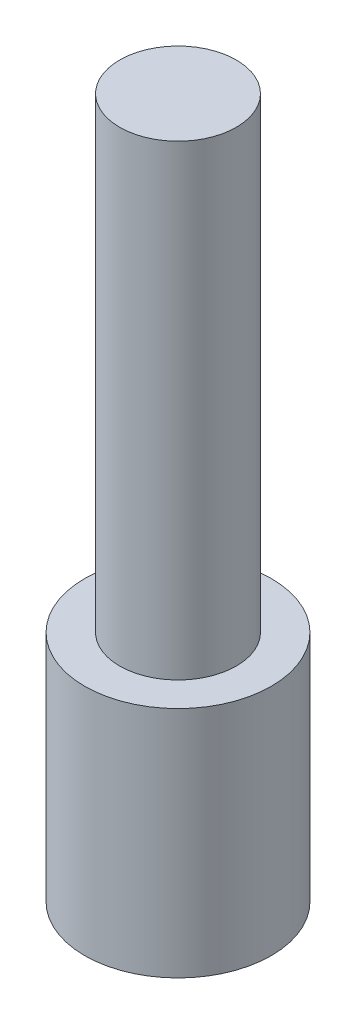
ISO-10303-21;
HEADER;
FILE_DESCRIPTION(('STEP AP214'),'2;1');
FILE_NAME('part.step','',(''),(''),'','','');
FILE_SCHEMA(('AUTOMOTIVE_DESIGN { 1 0 10303 214 1 1 1 1 }'));
ENDSEC;
DATA;
#1=APPLICATION_CONTEXT('core data for automotive mechanical design processes');
#2=APPLICATION_PROTOCOL_DEFINITION('international standard','automotive_design',2000,#1);
#3=PRODUCT_CONTEXT('',#1,'mechanical');
#4=PRODUCT('Part','Part','',(#3));
#5=PRODUCT_RELATED_PRODUCT_CATEGORY('part','',(#4));
#6=PRODUCT_DEFINITION_FORMATION('','',#4);
#7=PRODUCT_DEFINITION_CONTEXT('part definition',#1,'design');
#8=PRODUCT_DEFINITION('design','',#6,#7);
#9=PRODUCT_DEFINITION_SHAPE('','',#8);
#10=(LENGTH_UNIT() NAMED_UNIT(*) SI_UNIT(.MILLI.,.METRE.));
#11=(NAMED_UNIT(*) PLANE_ANGLE_UNIT() SI_UNIT($,.RADIAN.));
#12=(NAMED_UNIT(*) SI_UNIT($,.STERADIAN.) SOLID_ANGLE_UNIT());
#13=UNCERTAINTY_MEASURE_WITH_UNIT(LENGTH_MEASURE(1.E-05),#10,'distance_accuracy_value','');
#14=(GEOMETRIC_REPRESENTATION_CONTEXT(3) GLOBAL_UNCERTAINTY_ASSIGNED_CONTEXT((#13)) GLOBAL_UNIT_ASSIGNED_CONTEXT((#10,
#11,#12)) REPRESENTATION_CONTEXT('',''));
#15=CARTESIAN_POINT('',(0.,0.,0.));
#16=DIRECTION('',(0.,0.,1.));
#17=DIRECTION('',(1.,0.,0.));
#18=AXIS2_PLACEMENT_3D('',#15,#16,#17);
#19=CARTESIAN_POINT('',(0.,20.,0.));
#20=DIRECTION('',(0.,-1.,0.));
#21=DIRECTION('',(0.,0.,-1.));
#22=AXIS2_PLACEMENT_3D('',#19,#20,#21);
#23=CYLINDRICAL_SURFACE('',#22,2.5);
#24=CARTESIAN_POINT('',(0.,20.,0.));
#25=DIRECTION('',(0.,1.,0.));
#26=DIRECTION('',(0.,0.,1.));
#27=AXIS2_PLACEMENT_3D('',#24,#25,#26);
#28=CIRCLE('',#27,2.5);
#29=CARTESIAN_POINT('',(0.,20.,2.5));
#30=VERTEX_POINT('',#29);
#31=EDGE_CURVE('E10',#30,#30,#28,.T.);
#32=ORIENTED_EDGE('',*,*,#31,.F.);
#33=EDGE_LOOP('',(#32));
#34=FACE_BOUND('',#33,.T.);
#35=CARTESIAN_POINT('',(0.,0.,0.));
#36=DIRECTION('',(0.,1.,0.));
#37=DIRECTION('',(0.,0.,1.));
#38=AXIS2_PLACEMENT_3D('',#35,#36,#37);
#39=CIRCLE('',#38,2.5);
#40=CARTESIAN_POINT('',(0.,0.,2.5));
#41=VERTEX_POINT('',#40);
#42=EDGE_CURVE('E46',#41,#41,#39,.T.);
#43=ORIENTED_EDGE('',*,*,#42,.T.);
#44=EDGE_LOOP('',(#43));
#45=FACE_BOUND('',#44,.T.);
#46=ADVANCED_FACE('F43',(#34,#45),#23,.T.);
#47=CARTESIAN_POINT('',(0.,20.,0.));
#48=DIRECTION('',(0.,1.,0.));
#49=DIRECTION('',(0.,0.,1.));
#50=AXIS2_PLACEMENT_3D('',#47,#48,#49);
#51=PLANE('',#50);
#52=ORIENTED_EDGE('',*,*,#31,.T.);
#53=EDGE_LOOP('',(#52));
#54=FACE_BOUND('',#53,.T.);
#55=ADVANCED_FACE('F68',(#54),#51,.T.);
#56=CARTESIAN_POINT('',(0.,-10.,0.));
#57=DIRECTION('',(0.,1.,0.));
#58=DIRECTION('',(0.,0.,1.));
#59=AXIS2_PLACEMENT_3D('',#56,#57,#58);
#60=CYLINDRICAL_SURFACE('',#59,4.);
#61=CARTESIAN_POINT('',(0.,-10.,0.));
#62=DIRECTION('',(0.,-1.,0.));
#63=DIRECTION('',(0.,0.,-1.));
#64=AXIS2_PLACEMENT_3D('',#61,#62,#63);
#65=CIRCLE('',#64,4.);
#66=CARTESIAN_POINT('',(0.,-10.,-4.));
#67=VERTEX_POINT('',#66);
#68=EDGE_CURVE('E54',#67,#67,#65,.T.);
#69=ORIENTED_EDGE('',*,*,#68,.F.);
#70=EDGE_LOOP('',(#69));
#71=FACE_BOUND('',#70,.T.);
#72=CARTESIAN_POINT('',(0.,0.,0.));
#73=DIRECTION('',(0.,-1.,0.));
#74=DIRECTION('',(0.,0.,-1.));
#75=AXIS2_PLACEMENT_3D('',#72,#73,#74);
#76=CIRCLE('',#75,4.);
#77=CARTESIAN_POINT('',(0.,0.,-4.));
#78=VERTEX_POINT('',#77);
#79=EDGE_CURVE('E60',#78,#78,#76,.T.);
#80=ORIENTED_EDGE('',*,*,#79,.T.);
#81=EDGE_LOOP('',(#80));
#82=FACE_BOUND('',#81,.T.);
#83=ADVANCED_FACE('F70',(#71,#82),#60,.T.);
#84=CARTESIAN_POINT('',(0.,-10.,0.));
#85=DIRECTION('',(0.,-1.,0.));
#86=DIRECTION('',(0.,0.,-1.));
#87=AXIS2_PLACEMENT_3D('',#84,#85,#86);
#88=PLANE('',#87);
#89=ORIENTED_EDGE('',*,*,#68,.T.);
#90=EDGE_LOOP('',(#89));
#91=FACE_BOUND('',#90,.T.);
#92=ADVANCED_FACE('F64',(#91),#88,.T.);
#93=CARTESIAN_POINT('',(0.,0.,0.));
#94=DIRECTION('',(0.,-1.,0.));
#95=DIRECTION('',(0.,0.,-1.));
#96=AXIS2_PLACEMENT_3D('',#93,#94,#95);
#97=PLANE('',#96);
#98=ORIENTED_EDGE('',*,*,#42,.F.);
#99=EDGE_LOOP('',(#98));
#100=FACE_BOUND('',#99,.T.);
#101=ORIENTED_EDGE('',*,*,#79,.F.);
#102=EDGE_LOOP('',(#101));
#103=FACE_BOUND('',#102,.T.);
#104=ADVANCED_FACE('F72',(#100,#103),#97,.F.);
#105=CLOSED_SHELL('',(#46,#55,#83,#92,#104));
#106=MANIFOLD_SOLID_BREP('B2',#105);
#107=ADVANCED_BREP_SHAPE_REPRESENTATION('',(#18,#106),#14);
#108=SHAPE_DEFINITION_REPRESENTATION(#9,#107);
ENDSEC;
END-ISO-10303-21;
